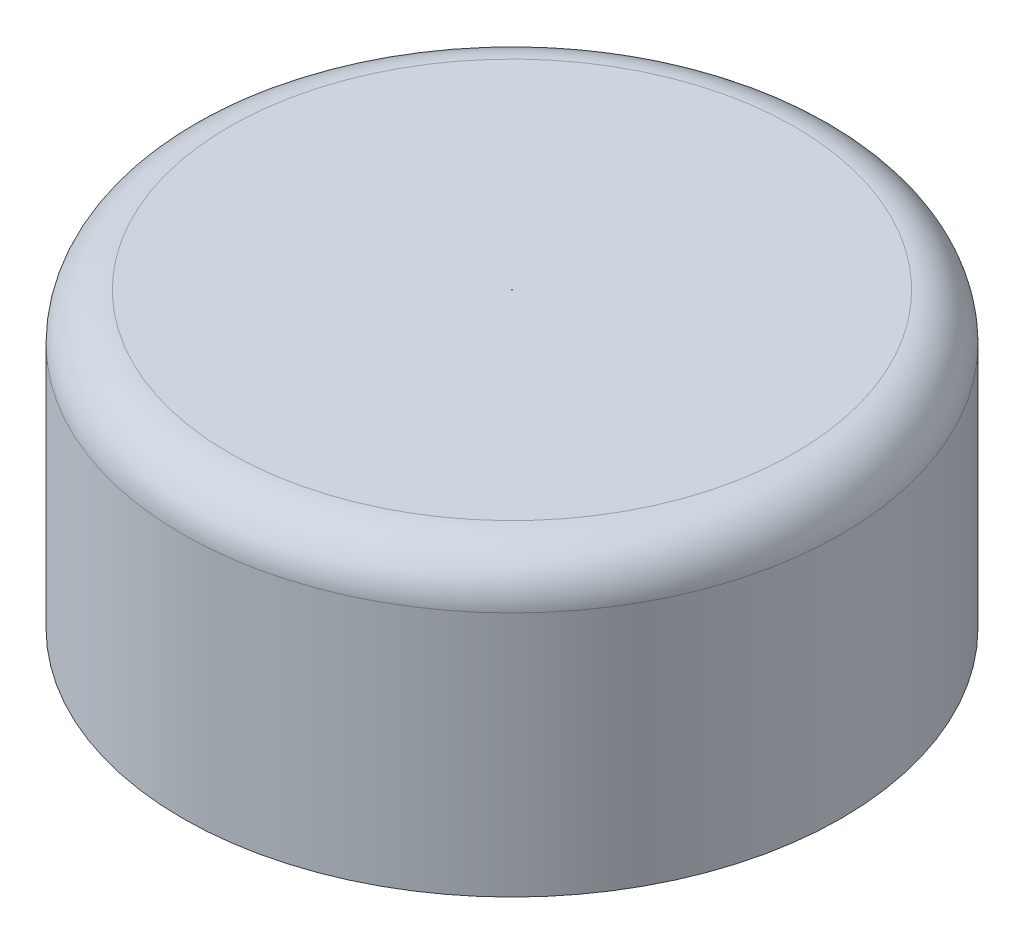
ISO-10303-21;
HEADER;
FILE_DESCRIPTION(('STEP AP214'),'2;1');
FILE_NAME('part.step','',(''),(''),'','','');
FILE_SCHEMA(('AUTOMOTIVE_DESIGN { 1 0 10303 214 1 1 1 1 }'));
ENDSEC;
DATA;
#1=APPLICATION_CONTEXT('core data for automotive mechanical design processes');
#2=APPLICATION_PROTOCOL_DEFINITION('international standard','automotive_design',2000,#1);
#3=PRODUCT_CONTEXT('',#1,'mechanical');
#4=PRODUCT('Part','Part','',(#3));
#5=PRODUCT_RELATED_PRODUCT_CATEGORY('part','',(#4));
#6=PRODUCT_DEFINITION_FORMATION('','',#4);
#7=PRODUCT_DEFINITION_CONTEXT('part definition',#1,'design');
#8=PRODUCT_DEFINITION('design','',#6,#7);
#9=PRODUCT_DEFINITION_SHAPE('','',#8);
#10=(LENGTH_UNIT() NAMED_UNIT(*) SI_UNIT(.MILLI.,.METRE.));
#11=(NAMED_UNIT(*) PLANE_ANGLE_UNIT() SI_UNIT($,.RADIAN.));
#12=(NAMED_UNIT(*) SI_UNIT($,.STERADIAN.) SOLID_ANGLE_UNIT());
#13=UNCERTAINTY_MEASURE_WITH_UNIT(LENGTH_MEASURE(1.E-05),#10,'distance_accuracy_value','');
#14=(GEOMETRIC_REPRESENTATION_CONTEXT(3) GLOBAL_UNCERTAINTY_ASSIGNED_CONTEXT((#13)) GLOBAL_UNIT_ASSIGNED_CONTEXT((#10,
#11,#12)) REPRESENTATION_CONTEXT('',''));
#15=CARTESIAN_POINT('',(0.,0.,0.));
#16=DIRECTION('',(0.,0.,1.));
#17=DIRECTION('',(1.,0.,0.));
#18=AXIS2_PLACEMENT_3D('',#15,#16,#17);
#19=CARTESIAN_POINT('',(0.,12.7,0.));
#20=DIRECTION('',(0.,-1.,0.));
#21=DIRECTION('',(0.,0.,-1.));
#22=AXIS2_PLACEMENT_3D('',#19,#20,#21);
#23=CYLINDRICAL_SURFACE('',#22,14.2875);
#24=CARTESIAN_POINT('',(0.,10.668,0.));
#25=DIRECTION('',(0.,1.,0.));
#26=DIRECTION('',(0.,0.,1.));
#27=AXIS2_PLACEMENT_3D('',#24,#25,#26);
#28=CIRCLE('',#27,14.2875);
#29=CARTESIAN_POINT('',(0.,10.668,14.2875));
#30=VERTEX_POINT('',#29);
#31=EDGE_CURVE('E10',#30,#30,#28,.F.);
#32=ORIENTED_EDGE('',*,*,#31,.T.);
#33=EDGE_LOOP('',(#32));
#34=FACE_BOUND('',#33,.T.);
#35=CARTESIAN_POINT('',(0.,0.,0.));
#36=DIRECTION('',(0.,1.,0.));
#37=DIRECTION('',(0.,0.,1.));
#38=AXIS2_PLACEMENT_3D('',#35,#36,#37);
#39=CIRCLE('',#38,14.2875);
#40=CARTESIAN_POINT('',(0.,0.,14.2875));
#41=VERTEX_POINT('',#40);
#42=EDGE_CURVE('E52',#41,#41,#39,.T.);
#43=ORIENTED_EDGE('',*,*,#42,.T.);
#44=EDGE_LOOP('',(#43));
#45=FACE_BOUND('',#44,.T.);
#46=ADVANCED_FACE('F41',(#34,#45),#23,.T.);
#47=CARTESIAN_POINT('',(0.,12.7,0.));
#48=DIRECTION('',(0.,1.,0.));
#49=DIRECTION('',(0.,0.,1.));
#50=AXIS2_PLACEMENT_3D('',#47,#48,#49);
#51=PLANE('',#50);
#52=CARTESIAN_POINT('',(0.,12.7,0.));
#53=DIRECTION('',(0.,1.,0.));
#54=DIRECTION('',(0.,0.,1.));
#55=AXIS2_PLACEMENT_3D('',#52,#53,#54);
#56=CIRCLE('',#55,0.0127);
#57=CARTESIAN_POINT('',(0.,12.7,0.0127));
#58=VERTEX_POINT('',#57);
#59=EDGE_CURVE('E67',#58,#58,#56,.T.);
#60=ORIENTED_EDGE('',*,*,#59,.F.);
#61=EDGE_LOOP('',(#60));
#62=FACE_BOUND('',#61,.T.);
#63=CARTESIAN_POINT('',(0.,12.7,0.));
#64=DIRECTION('',(0.,1.,0.));
#65=DIRECTION('',(0.,0.,1.));
#66=AXIS2_PLACEMENT_3D('',#63,#64,#65);
#67=CIRCLE('',#66,12.2555);
#68=CARTESIAN_POINT('',(0.,12.7,12.2555));
#69=VERTEX_POINT('',#68);
#70=EDGE_CURVE('E48',#69,#69,#67,.T.);
#71=ORIENTED_EDGE('',*,*,#70,.T.);
#72=EDGE_LOOP('',(#71));
#73=FACE_BOUND('',#72,.T.);
#74=ADVANCED_FACE('F74',(#62,#73),#51,.T.);
#75=CARTESIAN_POINT('',(0.,0.,0.));
#76=DIRECTION('',(0.,1.,0.));
#77=DIRECTION('',(0.,0.,1.));
#78=AXIS2_PLACEMENT_3D('',#75,#76,#77);
#79=PLANE('',#78);
#80=CARTESIAN_POINT('',(0.,0.,0.));
#81=DIRECTION('',(0.,1.,0.));
#82=DIRECTION('',(0.,0.,1.));
#83=AXIS2_PLACEMENT_3D('',#80,#81,#82);
#84=CIRCLE('',#83,11.7475);
#85=CARTESIAN_POINT('',(0.,0.,11.7475));
#86=VERTEX_POINT('',#85);
#87=EDGE_CURVE('E59',#86,#86,#84,.T.);
#88=ORIENTED_EDGE('',*,*,#87,.T.);
#89=EDGE_LOOP('',(#88));
#90=FACE_BOUND('',#89,.T.);
#91=ORIENTED_EDGE('',*,*,#42,.F.);
#92=EDGE_LOOP('',(#91));
#93=FACE_BOUND('',#92,.T.);
#94=ADVANCED_FACE('F76',(#90,#93),#79,.F.);
#95=CARTESIAN_POINT('',(0.,10.668,0.));
#96=DIRECTION('',(0.,1.,0.));
#97=DIRECTION('',(0.,0.,1.));
#98=AXIS2_PLACEMENT_3D('',#95,#96,#97);
#99=TOROIDAL_SURFACE('',#98,12.2555,2.032);
#100=ORIENTED_EDGE('',*,*,#31,.F.);
#101=EDGE_LOOP('',(#100));
#102=FACE_BOUND('',#101,.T.);
#103=ORIENTED_EDGE('',*,*,#70,.F.);
#104=EDGE_LOOP('',(#103));
#105=FACE_BOUND('',#104,.T.);
#106=ADVANCED_FACE('F43',(#102,#105),#99,.T.);
#107=CARTESIAN_POINT('',(0.,12.7,0.));
#108=DIRECTION('',(0.,-1.,0.));
#109=DIRECTION('',(0.,0.,-1.));
#110=AXIS2_PLACEMENT_3D('',#107,#108,#109);
#111=CYLINDRICAL_SURFACE('',#110,11.7475);
#112=CARTESIAN_POINT('',(0.,10.16,0.));
#113=DIRECTION('',(0.,1.,0.));
#114=DIRECTION('',(0.,0.,1.));
#115=AXIS2_PLACEMENT_3D('',#112,#113,#114);
#116=CIRCLE('',#115,11.7475);
#117=CARTESIAN_POINT('',(0.,10.16,11.7475));
#118=VERTEX_POINT('',#117);
#119=EDGE_CURVE('E56',#118,#118,#116,.T.);
#120=ORIENTED_EDGE('',*,*,#119,.T.);
#121=EDGE_LOOP('',(#120));
#122=FACE_BOUND('',#121,.T.);
#123=ORIENTED_EDGE('',*,*,#87,.F.);
#124=EDGE_LOOP('',(#123));
#125=FACE_BOUND('',#124,.T.);
#126=ADVANCED_FACE('F88',(#122,#125),#111,.F.);
#127=CARTESIAN_POINT('',(0.,10.16,0.));
#128=DIRECTION('',(0.,1.,0.));
#129=DIRECTION('',(0.,0.,1.));
#130=AXIS2_PLACEMENT_3D('',#127,#128,#129);
#131=PLANE('',#130);
#132=CARTESIAN_POINT('',(0.,10.16,0.));
#133=DIRECTION('',(0.,1.,0.));
#134=DIRECTION('',(0.,0.,1.));
#135=AXIS2_PLACEMENT_3D('',#132,#133,#134);
#136=CIRCLE('',#135,0.0127);
#137=CARTESIAN_POINT('',(0.,10.16,0.0127));
#138=VERTEX_POINT('',#137);
#139=EDGE_CURVE('E62',#138,#138,#136,.F.);
#140=ORIENTED_EDGE('',*,*,#139,.F.);
#141=EDGE_LOOP('',(#140));
#142=FACE_BOUND('',#141,.T.);
#143=ORIENTED_EDGE('',*,*,#119,.F.);
#144=EDGE_LOOP('',(#143));
#145=FACE_BOUND('',#144,.T.);
#146=ADVANCED_FACE('F85',(#142,#145),#131,.F.);
#147=CARTESIAN_POINT('',(0.,-0.000999999999999265,0.));
#148=DIRECTION('',(0.,1.,0.));
#149=DIRECTION('',(0.,0.,1.));
#150=AXIS2_PLACEMENT_3D('',#147,#148,#149);
#151=CYLINDRICAL_SURFACE('',#150,0.0127);
#152=ORIENTED_EDGE('',*,*,#59,.T.);
#153=EDGE_LOOP('',(#152));
#154=FACE_BOUND('',#153,.T.);
#155=ORIENTED_EDGE('',*,*,#139,.T.);
#156=EDGE_LOOP('',(#155));
#157=FACE_BOUND('',#156,.T.);
#158=ADVANCED_FACE('F71',(#154,#157),#151,.F.);
#159=CLOSED_SHELL('',(#46,#74,#94,#106,#126,#146,#158));
#160=MANIFOLD_SOLID_BREP('B2',#159);
#161=ADVANCED_BREP_SHAPE_REPRESENTATION('',(#18,#160),#14);
#162=SHAPE_DEFINITION_REPRESENTATION(#9,#161);
ENDSEC;
END-ISO-10303-21;
